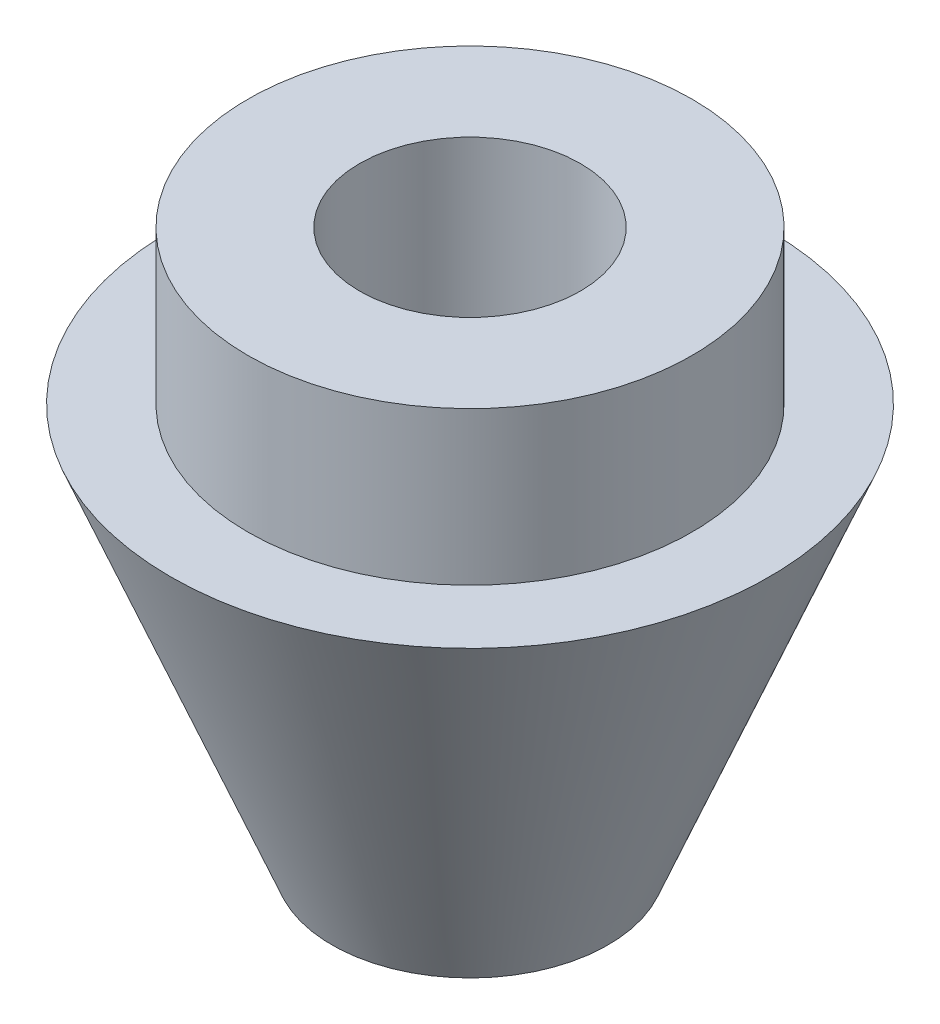
ISO-10303-21;
HEADER;
FILE_DESCRIPTION(('STEP AP214'),'2;1');
FILE_NAME('part.step','',(''),(''),'','','');
FILE_SCHEMA(('AUTOMOTIVE_DESIGN { 1 0 10303 214 1 1 1 1 }'));
ENDSEC;
DATA;
#1=APPLICATION_CONTEXT('core data for automotive mechanical design processes');
#2=APPLICATION_PROTOCOL_DEFINITION('international standard','automotive_design',2000,#1);
#3=PRODUCT_CONTEXT('',#1,'mechanical');
#4=PRODUCT('Part','Part','',(#3));
#5=PRODUCT_RELATED_PRODUCT_CATEGORY('part','',(#4));
#6=PRODUCT_DEFINITION_FORMATION('','',#4);
#7=PRODUCT_DEFINITION_CONTEXT('part definition',#1,'design');
#8=PRODUCT_DEFINITION('design','',#6,#7);
#9=PRODUCT_DEFINITION_SHAPE('','',#8);
#10=(LENGTH_UNIT() NAMED_UNIT(*) SI_UNIT(.MILLI.,.METRE.));
#11=(NAMED_UNIT(*) PLANE_ANGLE_UNIT() SI_UNIT($,.RADIAN.));
#12=(NAMED_UNIT(*) SI_UNIT($,.STERADIAN.) SOLID_ANGLE_UNIT());
#13=UNCERTAINTY_MEASURE_WITH_UNIT(LENGTH_MEASURE(1.E-05),#10,'distance_accuracy_value','');
#14=(GEOMETRIC_REPRESENTATION_CONTEXT(3) GLOBAL_UNCERTAINTY_ASSIGNED_CONTEXT((#13)) GLOBAL_UNIT_ASSIGNED_CONTEXT((#10,
#11,#12)) REPRESENTATION_CONTEXT('',''));
#15=CARTESIAN_POINT('',(0.,0.,0.));
#16=DIRECTION('',(0.,0.,1.));
#17=DIRECTION('',(1.,0.,0.));
#18=AXIS2_PLACEMENT_3D('',#15,#16,#17);
#19=CARTESIAN_POINT('',(-3.175,0.,0.));
#20=DIRECTION('',(0.,1.,0.));
#21=DIRECTION('',(0.,0.,1.));
#22=AXIS2_PLACEMENT_3D('',#19,#20,#21);
#23=PLANE('',#22);
#24=CARTESIAN_POINT('',(0.,0.,0.));
#25=DIRECTION('',(0.,1.,0.));
#26=DIRECTION('',(0.,0.,1.));
#27=AXIS2_PLACEMENT_3D('',#24,#25,#26);
#28=CIRCLE('',#27,2.54);
#29=CARTESIAN_POINT('',(0.,0.,2.54));
#30=VERTEX_POINT('',#29);
#31=EDGE_CURVE('E72',#30,#30,#28,.T.);
#32=ORIENTED_EDGE('',*,*,#31,.T.);
#33=EDGE_LOOP('',(#32));
#34=FACE_BOUND('',#33,.T.);
#35=CARTESIAN_POINT('',(0.,0.,0.));
#36=DIRECTION('',(0.,-1.,0.));
#37=DIRECTION('',(0.,0.,-1.));
#38=AXIS2_PLACEMENT_3D('',#35,#36,#37);
#39=CIRCLE('',#38,3.175);
#40=CARTESIAN_POINT('',(0.,0.,-3.175));
#41=VERTEX_POINT('',#40);
#42=EDGE_CURVE('E66',#41,#41,#39,.T.);
#43=ORIENTED_EDGE('',*,*,#42,.T.);
#44=EDGE_LOOP('',(#43));
#45=FACE_BOUND('',#44,.T.);
#46=ADVANCED_FACE('F49',(#34,#45),#23,.F.);
#47=CARTESIAN_POINT('',(0.,12.7,0.));
#48=DIRECTION('',(0.,-1.,0.));
#49=DIRECTION('',(0.,0.,-1.));
#50=AXIS2_PLACEMENT_3D('',#47,#48,#49);
#51=PLANE('',#50);
#52=CARTESIAN_POINT('',(0.,12.7,0.));
#53=DIRECTION('',(0.,1.,0.));
#54=DIRECTION('',(0.,0.,1.));
#55=AXIS2_PLACEMENT_3D('',#52,#53,#54);
#56=CIRCLE('',#55,2.54);
#57=CARTESIAN_POINT('',(0.,12.7,2.54));
#58=VERTEX_POINT('',#57);
#59=EDGE_CURVE('E73',#58,#58,#56,.T.);
#60=ORIENTED_EDGE('',*,*,#59,.F.);
#61=EDGE_LOOP('',(#60));
#62=FACE_BOUND('',#61,.T.);
#63=CARTESIAN_POINT('',(0.,12.7,0.));
#64=DIRECTION('',(0.,-1.,0.));
#65=DIRECTION('',(0.,0.,-1.));
#66=AXIS2_PLACEMENT_3D('',#63,#64,#65);
#67=CIRCLE('',#66,5.1054);
#68=CARTESIAN_POINT('',(0.,12.7,-5.1054));
#69=VERTEX_POINT('',#68);
#70=EDGE_CURVE('E12',#69,#69,#67,.T.);
#71=ORIENTED_EDGE('',*,*,#70,.F.);
#72=EDGE_LOOP('',(#71));
#73=FACE_BOUND('',#72,.T.);
#74=ADVANCED_FACE('F90',(#62,#73),#51,.F.);
#75=CARTESIAN_POINT('',(0.,0.,0.));
#76=DIRECTION('',(0.,-1.,0.));
#77=DIRECTION('',(0.,0.,-1.));
#78=AXIS2_PLACEMENT_3D('',#75,#76,#77);
#79=CYLINDRICAL_SURFACE('',#78,5.1054);
#80=CARTESIAN_POINT('',(0.,9.18378870673953,0.));
#81=DIRECTION('',(0.,-1.,0.));
#82=DIRECTION('',(0.,0.,-1.));
#83=AXIS2_PLACEMENT_3D('',#80,#81,#82);
#84=CIRCLE('',#83,5.1054);
#85=CARTESIAN_POINT('',(0.,9.18378870673953,-5.1054));
#86=VERTEX_POINT('',#85);
#87=EDGE_CURVE('E56',#86,#86,#84,.T.);
#88=ORIENTED_EDGE('',*,*,#87,.F.);
#89=EDGE_LOOP('',(#88));
#90=FACE_BOUND('',#89,.T.);
#91=ORIENTED_EDGE('',*,*,#70,.T.);
#92=EDGE_LOOP('',(#91));
#93=FACE_BOUND('',#92,.T.);
#94=ADVANCED_FACE('F93',(#90,#93),#79,.T.);
#95=CARTESIAN_POINT('',(-5.1054,9.18378870673953,0.));
#96=DIRECTION('',(0.,-1.,0.));
#97=DIRECTION('',(0.,0.,-1.));
#98=AXIS2_PLACEMENT_3D('',#95,#96,#97);
#99=PLANE('',#98);
#100=CARTESIAN_POINT('',(0.,9.18378870673953,0.));
#101=DIRECTION('',(0.,-1.,0.));
#102=DIRECTION('',(0.,0.,-1.));
#103=AXIS2_PLACEMENT_3D('',#100,#101,#102);
#104=CIRCLE('',#103,6.8834);
#105=CARTESIAN_POINT('',(0.,9.18378870673953,-6.8834));
#106=VERTEX_POINT('',#105);
#107=EDGE_CURVE('E61',#106,#106,#104,.T.);
#108=ORIENTED_EDGE('',*,*,#107,.F.);
#109=EDGE_LOOP('',(#108));
#110=FACE_BOUND('',#109,.T.);
#111=ORIENTED_EDGE('',*,*,#87,.T.);
#112=EDGE_LOOP('',(#111));
#113=FACE_BOUND('',#112,.T.);
#114=ADVANCED_FACE('F98',(#110,#113),#99,.F.);
#115=CARTESIAN_POINT('',(0.,9.18378870673953,0.));
#116=DIRECTION('',(0.,1.,0.));
#117=DIRECTION('',(0.,0.,1.));
#118=AXIS2_PLACEMENT_3D('',#115,#116,#117);
#119=CONICAL_SURFACE('',#118,6.8834,0.383776641163629);
#120=ORIENTED_EDGE('',*,*,#42,.F.);
#121=EDGE_LOOP('',(#120));
#122=FACE_BOUND('',#121,.T.);
#123=ORIENTED_EDGE('',*,*,#107,.T.);
#124=EDGE_LOOP('',(#123));
#125=FACE_BOUND('',#124,.T.);
#126=ADVANCED_FACE('F86',(#122,#125),#119,.T.);
#127=CARTESIAN_POINT('',(0.,0.,0.));
#128=DIRECTION('',(0.,1.,0.));
#129=DIRECTION('',(0.,0.,1.));
#130=AXIS2_PLACEMENT_3D('',#127,#128,#129);
#131=CYLINDRICAL_SURFACE('',#130,2.54);
#132=ORIENTED_EDGE('',*,*,#31,.F.);
#133=EDGE_LOOP('',(#132));
#134=FACE_BOUND('',#133,.T.);
#135=ORIENTED_EDGE('',*,*,#59,.T.);
#136=EDGE_LOOP('',(#135));
#137=FACE_BOUND('',#136,.T.);
#138=ADVANCED_FACE('F83',(#134,#137),#131,.F.);
#139=CLOSED_SHELL('',(#46,#74,#94,#114,#126,#138));
#140=MANIFOLD_SOLID_BREP('B2',#139);
#141=ADVANCED_BREP_SHAPE_REPRESENTATION('',(#18,#140),#14);
#142=SHAPE_DEFINITION_REPRESENTATION(#9,#141);
ENDSEC;
END-ISO-10303-21;
